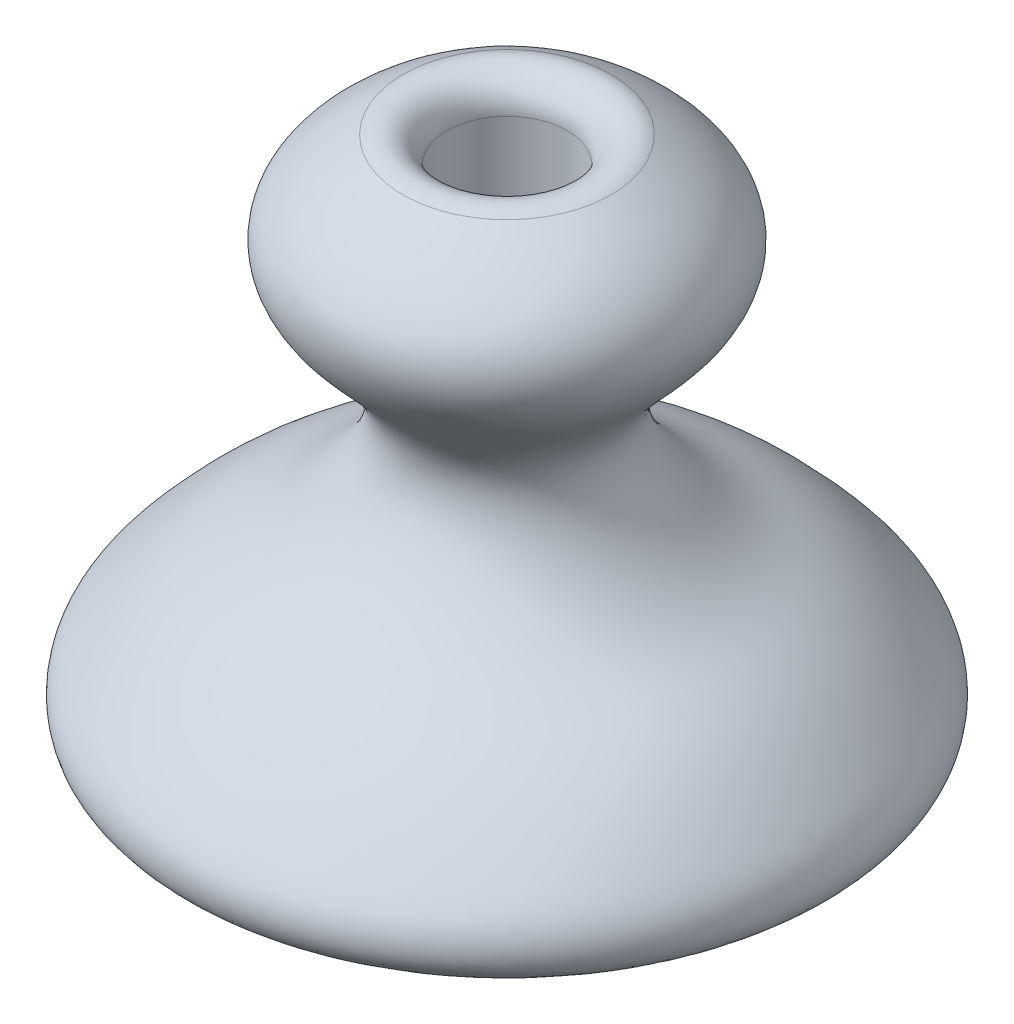
ISO-10303-21;
HEADER;
FILE_DESCRIPTION(('STEP AP214'),'2;1');
FILE_NAME('part.step','',(''),(''),'','','');
FILE_SCHEMA(('AUTOMOTIVE_DESIGN { 1 0 10303 214 1 1 1 1 }'));
ENDSEC;
DATA;
#1=APPLICATION_CONTEXT('core data for automotive mechanical design processes');
#2=APPLICATION_PROTOCOL_DEFINITION('international standard','automotive_design',2000,#1);
#3=PRODUCT_CONTEXT('',#1,'mechanical');
#4=PRODUCT('Part','Part','',(#3));
#5=PRODUCT_RELATED_PRODUCT_CATEGORY('part','',(#4));
#6=PRODUCT_DEFINITION_FORMATION('','',#4);
#7=PRODUCT_DEFINITION_CONTEXT('part definition',#1,'design');
#8=PRODUCT_DEFINITION('design','',#6,#7);
#9=PRODUCT_DEFINITION_SHAPE('','',#8);
#10=(LENGTH_UNIT() NAMED_UNIT(*) SI_UNIT(.MILLI.,.METRE.));
#11=(NAMED_UNIT(*) PLANE_ANGLE_UNIT() SI_UNIT($,.RADIAN.));
#12=(NAMED_UNIT(*) SI_UNIT($,.STERADIAN.) SOLID_ANGLE_UNIT());
#13=UNCERTAINTY_MEASURE_WITH_UNIT(LENGTH_MEASURE(1.E-05),#10,'distance_accuracy_value','');
#14=(GEOMETRIC_REPRESENTATION_CONTEXT(3) GLOBAL_UNCERTAINTY_ASSIGNED_CONTEXT((#13)) GLOBAL_UNIT_ASSIGNED_CONTEXT((#10,
#11,#12)) REPRESENTATION_CONTEXT('',''));
#15=CARTESIAN_POINT('',(0.,0.,0.));
#16=DIRECTION('',(0.,0.,1.));
#17=DIRECTION('',(1.,0.,0.));
#18=AXIS2_PLACEMENT_3D('',#15,#16,#17);
#19=CARTESIAN_POINT('',(0.,0.,0.));
#20=DIRECTION('',(0.,-1.,0.));
#21=DIRECTION('',(0.,0.,-1.));
#22=AXIS2_PLACEMENT_3D('',#19,#20,#21);
#23=PLANE('',#22);
#24=CARTESIAN_POINT('',(0.,0.,0.));
#25=DIRECTION('',(0.,1.,0.));
#26=DIRECTION('',(0.,0.,1.));
#27=AXIS2_PLACEMENT_3D('',#24,#25,#26);
#28=CIRCLE('',#27,1.65);
#29=CARTESIAN_POINT('',(0.,0.,1.65));
#30=VERTEX_POINT('',#29);
#31=EDGE_CURVE('E79',#30,#30,#28,.T.);
#32=ORIENTED_EDGE('',*,*,#31,.T.);
#33=EDGE_LOOP('',(#32));
#34=FACE_BOUND('',#33,.T.);
#35=CARTESIAN_POINT('',(0.,0.,0.));
#36=DIRECTION('',(0.,-1.,0.));
#37=DIRECTION('',(0.,0.,-1.));
#38=AXIS2_PLACEMENT_3D('',#35,#36,#37);
#39=CIRCLE('',#38,20.0807678872852);
#40=CARTESIAN_POINT('',(0.,0.,-20.0807678872852));
#41=VERTEX_POINT('',#40);
#42=EDGE_CURVE('E50',#41,#41,#39,.T.);
#43=ORIENTED_EDGE('',*,*,#42,.T.);
#44=EDGE_LOOP('',(#43));
#45=FACE_BOUND('',#44,.T.);
#46=ADVANCED_FACE('F39',(#34,#45),#23,.T.);
#47=CARTESIAN_POINT('',(0.,0.,-20.0807678872852));
#48=CARTESIAN_POINT('',(0.,0.396173772390321,-21.6199221698401));
#49=CARTESIAN_POINT('',(0.,2.70296227834426,-22.048203388095));
#50=CARTESIAN_POINT('',(0.,9.55451913785757,-16.3183999422914));
#51=CARTESIAN_POINT('',(0.,9.668097731759,-12.0125341436703));
#52=CARTESIAN_POINT('',(0.,18.9085649419771,-4.13647865449134));
#53=CARTESIAN_POINT('',(0.,28.1081590047247,-15.7867168481771));
#54=CARTESIAN_POINT('',(0.,33.6810740228545,-10.5058352734849));
#55=CARTESIAN_POINT('',(0.,36.9438677996584,0.));
#56=B_SPLINE_CURVE_WITH_KNOTS('',3,(#47,#48,#49,#50,#51,#52,#53,#54,#55),.UNSPECIFIED.,.F.,.F.,
(4,1,1,1,1,1,4),(0.,0.0421215486443681,0.0743029952498242,0.32181446605456,0.524436490351398,
0.650070140967103,1.),.UNSPECIFIED.);
#57=CARTESIAN_POINT('',(0.,0.,0.));
#58=DIRECTION('',(0.,-1.,0.));
#59=AXIS1_PLACEMENT('',#57,#58);
#60=SURFACE_OF_REVOLUTION('',#56,#59);
#61=CARTESIAN_POINT('',(0.,34.1853832810282,0.));
#62=DIRECTION('',(0.,-1.,0.));
#63=DIRECTION('',(0.,0.,-1.));
#64=AXIS2_PLACEMENT_3D('',#61,#62,#63);
#65=CIRCLE('',#64,6.93528781892023);
#66=CARTESIAN_POINT('',(0.,34.1853832810282,-6.93528781892023));
#67=VERTEX_POINT('',#66);
#68=EDGE_CURVE('E10',#67,#67,#65,.T.);
#69=ORIENTED_EDGE('',*,*,#68,.T.);
#70=EDGE_LOOP('',(#69));
#71=FACE_BOUND('',#70,.T.);
#72=ORIENTED_EDGE('',*,*,#42,.F.);
#73=EDGE_LOOP('',(#72));
#74=FACE_BOUND('',#73,.T.);
#75=ADVANCED_FACE('F66',(#71,#74),#60,.F.);
#76=CARTESIAN_POINT('',(0.,36.9438677996584,0.));
#77=DIRECTION('',(0.,-1.,0.));
#78=DIRECTION('',(0.,0.,-1.));
#79=AXIS2_PLACEMENT_3D('',#76,#77,#78);
#80=CYLINDRICAL_SURFACE('',#79,4.);
#81=CARTESIAN_POINT('',(0.,32.4175493816532,0.));
#82=DIRECTION('',(0.,-1.,0.));
#83=DIRECTION('',(0.,0.,-1.));
#84=AXIS2_PLACEMENT_3D('',#81,#82,#83);
#85=CIRCLE('',#84,4.);
#86=CARTESIAN_POINT('',(0.,32.4175493816532,-4.));
#87=VERTEX_POINT('',#86);
#88=EDGE_CURVE('E46',#87,#87,#85,.F.);
#89=ORIENTED_EDGE('',*,*,#88,.T.);
#90=EDGE_LOOP('',(#89));
#91=FACE_BOUND('',#90,.T.);
#92=CARTESIAN_POINT('',(0.,5.,0.));
#93=DIRECTION('',(0.,-1.,0.));
#94=DIRECTION('',(0.,0.,-1.));
#95=AXIS2_PLACEMENT_3D('',#92,#93,#94);
#96=CIRCLE('',#95,4.);
#97=CARTESIAN_POINT('',(0.,5.,-4.));
#98=VERTEX_POINT('',#97);
#99=EDGE_CURVE('E54',#98,#98,#96,.T.);
#100=ORIENTED_EDGE('',*,*,#99,.T.);
#101=EDGE_LOOP('',(#100));
#102=FACE_BOUND('',#101,.T.);
#103=ADVANCED_FACE('F69',(#91,#102),#80,.F.);
#104=CARTESIAN_POINT('',(0.,5.,0.));
#105=DIRECTION('',(0.,-1.,0.));
#106=DIRECTION('',(0.,0.,-1.));
#107=AXIS2_PLACEMENT_3D('',#104,#105,#106);
#108=PLANE('',#107);
#109=CARTESIAN_POINT('',(0.,5.,0.));
#110=DIRECTION('',(0.,1.,0.));
#111=DIRECTION('',(0.,0.,1.));
#112=AXIS2_PLACEMENT_3D('',#109,#110,#111);
#113=CIRCLE('',#112,1.65);
#114=CARTESIAN_POINT('',(0.,5.,1.65));
#115=VERTEX_POINT('',#114);
#116=EDGE_CURVE('E83',#115,#115,#113,.T.);
#117=ORIENTED_EDGE('',*,*,#116,.F.);
#118=EDGE_LOOP('',(#117));
#119=FACE_BOUND('',#118,.T.);
#120=ORIENTED_EDGE('',*,*,#99,.F.);
#121=EDGE_LOOP('',(#120));
#122=FACE_BOUND('',#121,.T.);
#123=ADVANCED_FACE('F91',(#119,#122),#108,.F.);
#124=CARTESIAN_POINT('',(0.,0.,0.));
#125=DIRECTION('',(0.,1.,0.));
#126=DIRECTION('',(0.,0.,1.));
#127=AXIS2_PLACEMENT_3D('',#124,#125,#126);
#128=CYLINDRICAL_SURFACE('',#127,1.65);
#129=ORIENTED_EDGE('',*,*,#31,.F.);
#130=EDGE_LOOP('',(#129));
#131=FACE_BOUND('',#130,.T.);
#132=ORIENTED_EDGE('',*,*,#116,.T.);
#133=EDGE_LOOP('',(#132));
#134=FACE_BOUND('',#133,.T.);
#135=ADVANCED_FACE('F89',(#131,#134),#128,.F.);
#136=CARTESIAN_POINT('',(0.,32.4175493816532,0.));
#137=DIRECTION('',(0.,-1.,0.));
#138=DIRECTION('',(0.,0.,-1.));
#139=AXIS2_PLACEMENT_3D('',#136,#137,#138);
#140=TOROIDAL_SURFACE('',#139,6.,2.);
#141=ORIENTED_EDGE('',*,*,#68,.F.);
#142=EDGE_LOOP('',(#141));
#143=FACE_BOUND('',#142,.T.);
#144=ORIENTED_EDGE('',*,*,#88,.F.);
#145=EDGE_LOOP('',(#144));
#146=FACE_BOUND('',#145,.T.);
#147=ADVANCED_FACE('F41',(#143,#146),#140,.T.);
#148=CLOSED_SHELL('',(#46,#75,#103,#123,#135,#147));
#149=MANIFOLD_SOLID_BREP('B2',#148);
#150=ADVANCED_BREP_SHAPE_REPRESENTATION('',(#18,#149),#14);
#151=SHAPE_DEFINITION_REPRESENTATION(#9,#150);
ENDSEC;
END-ISO-10303-21;
